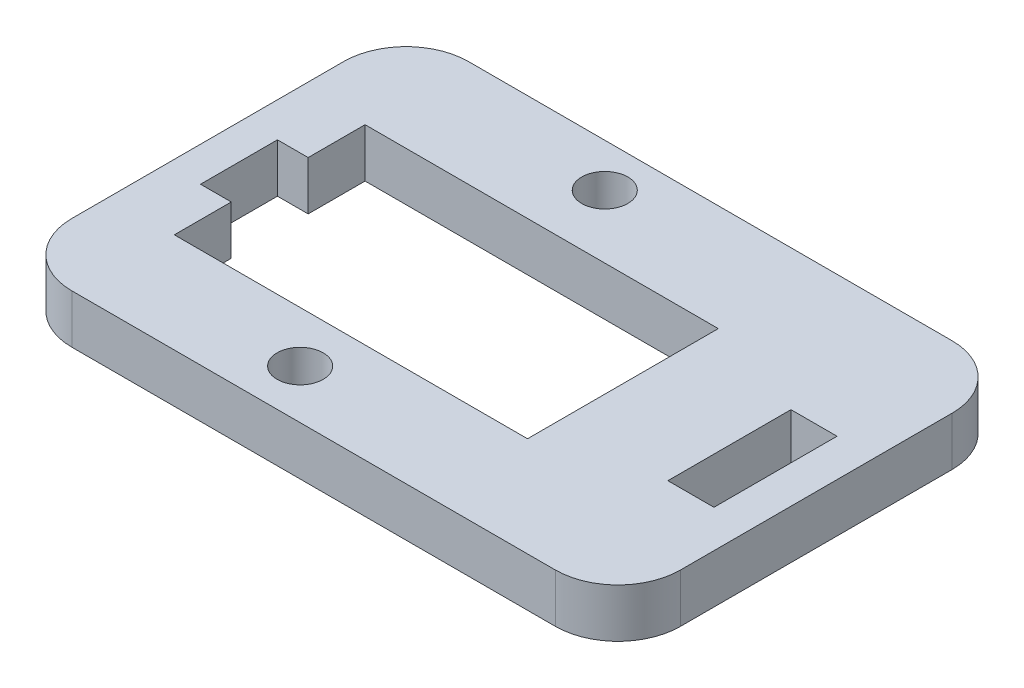
ISO-10303-21;
HEADER;
FILE_DESCRIPTION(('STEP AP214'),'2;1');
FILE_NAME('part.step','',(''),(''),'','','');
FILE_SCHEMA(('AUTOMOTIVE_DESIGN { 1 0 10303 214 1 1 1 1 }'));
ENDSEC;
DATA;
#1=APPLICATION_CONTEXT('core data for automotive mechanical design processes');
#2=APPLICATION_PROTOCOL_DEFINITION('international standard','automotive_design',2000,#1);
#3=PRODUCT_CONTEXT('',#1,'mechanical');
#4=PRODUCT('Part','Part','',(#3));
#5=PRODUCT_RELATED_PRODUCT_CATEGORY('part','',(#4));
#6=PRODUCT_DEFINITION_FORMATION('','',#4);
#7=PRODUCT_DEFINITION_CONTEXT('part definition',#1,'design');
#8=PRODUCT_DEFINITION('design','',#6,#7);
#9=PRODUCT_DEFINITION_SHAPE('','',#8);
#10=(LENGTH_UNIT() NAMED_UNIT(*) SI_UNIT(.MILLI.,.METRE.));
#11=(NAMED_UNIT(*) PLANE_ANGLE_UNIT() SI_UNIT($,.RADIAN.));
#12=(NAMED_UNIT(*) SI_UNIT($,.STERADIAN.) SOLID_ANGLE_UNIT());
#13=UNCERTAINTY_MEASURE_WITH_UNIT(LENGTH_MEASURE(1.E-05),#10,'distance_accuracy_value','');
#14=(GEOMETRIC_REPRESENTATION_CONTEXT(3) GLOBAL_UNCERTAINTY_ASSIGNED_CONTEXT((#13)) GLOBAL_UNIT_ASSIGNED_CONTEXT((#10,
#11,#12)) REPRESENTATION_CONTEXT('',''));
#15=CARTESIAN_POINT('',(0.,0.,0.));
#16=DIRECTION('',(0.,0.,1.));
#17=DIRECTION('',(1.,0.,0.));
#18=AXIS2_PLACEMENT_3D('',#15,#16,#17);
#19=CARTESIAN_POINT('',(-15.7246893452081,3.175,-9.30453983697956));
#20=DIRECTION('',(0.,1.,0.));
#21=DIRECTION('',(0.,0.,1.));
#22=AXIS2_PLACEMENT_3D('',#19,#20,#21);
#23=PLANE('',#22);
#24=CARTESIAN_POINT('',(-4.05405437404931,3.175,-10.5490547460856));
#25=DIRECTION('',(0.,1.,0.));
#26=DIRECTION('',(0.,0.,1.));
#27=AXIS2_PLACEMENT_3D('',#24,#25,#26);
#28=CIRCLE('',#27,1.4972665);
#29=CARTESIAN_POINT('',(-4.05405437404931,3.175,-9.05178824608557));
#30=VERTEX_POINT('',#29);
#31=EDGE_CURVE('E198',#30,#30,#28,.T.);
#32=ORIENTED_EDGE('',*,*,#31,.F.);
#33=EDGE_LOOP('',(#32));
#34=FACE_BOUND('',#33,.T.);
#35=CARTESIAN_POINT('',(-15.7246893452081,3.175,-9.30453983697956));
#36=DIRECTION('',(0.,1.,0.));
#37=DIRECTION('',(0.,0.,1.));
#38=AXIS2_PLACEMENT_3D('',#35,#36,#37);
#39=CIRCLE('',#38,4.06012955345441);
#40=CARTESIAN_POINT('',(-15.7246893452081,3.175,-13.364669390434));
#41=VERTEX_POINT('',#40);
#42=CARTESIAN_POINT('',(-19.7848188986625,3.175,-9.30453983697956));
#43=VERTEX_POINT('',#42);
#44=EDGE_CURVE('E267',#41,#43,#39,.T.);
#45=ORIENTED_EDGE('',*,*,#44,.T.);
#46=DIRECTION('',(0.,0.,1.));
#47=VECTOR('',#46,1.);
#48=CARTESIAN_POINT('',(-19.7848188986625,3.175,8.36700930805023));
#49=LINE('',#48,#47);
#50=CARTESIAN_POINT('',(-19.7848188986625,3.175,8.36700930805023));
#51=VERTEX_POINT('',#50);
#52=EDGE_CURVE('E270',#43,#51,#49,.T.);
#53=ORIENTED_EDGE('',*,*,#52,.T.);
#54=CARTESIAN_POINT('',(-15.7173287794815,3.175,8.36700930805023));
#55=DIRECTION('',(0.,1.,0.));
#56=DIRECTION('',(0.,0.,1.));
#57=AXIS2_PLACEMENT_3D('',#54,#55,#56);
#58=CIRCLE('',#57,4.06749011918107);
#59=CARTESIAN_POINT('',(-15.7173287794815,3.175,12.4344994272313));
#60=VERTEX_POINT('',#59);
#61=EDGE_CURVE('E273',#51,#60,#58,.T.);
#62=ORIENTED_EDGE('',*,*,#61,.T.);
#63=DIRECTION('',(1.,0.,0.));
#64=VECTOR('',#63,1.);
#65=CARTESIAN_POINT('',(15.7245010226577,3.175,12.4344994272313));
#66=LINE('',#65,#64);
#67=CARTESIAN_POINT('',(15.7245010226577,3.175,12.4344994272313));
#68=VERTEX_POINT('',#67);
#69=EDGE_CURVE('E275',#60,#68,#66,.T.);
#70=ORIENTED_EDGE('',*,*,#69,.T.);
#71=CARTESIAN_POINT('',(15.7245010226577,3.175,8.37417522857416));
#72=DIRECTION('',(0.,1.,0.));
#73=DIRECTION('',(0.,0.,1.));
#74=AXIS2_PLACEMENT_3D('',#71,#72,#73);
#75=CIRCLE('',#74,4.06032419865714);
#76=CARTESIAN_POINT('',(19.7848252213149,3.175,8.37417522857416));
#77=VERTEX_POINT('',#76);
#78=EDGE_CURVE('E277',#68,#77,#75,.T.);
#79=ORIENTED_EDGE('',*,*,#78,.T.);
#80=DIRECTION('',(0.,0.,-1.));
#81=VECTOR('',#80,1.);
#82=CARTESIAN_POINT('',(19.7848252213149,3.175,-9.2971845115234));
#83=LINE('',#82,#81);
#84=CARTESIAN_POINT('',(19.7848252213149,3.175,-9.2971845115234));
#85=VERTEX_POINT('',#84);
#86=EDGE_CURVE('E279',#77,#85,#83,.T.);
#87=ORIENTED_EDGE('',*,*,#86,.T.);
#88=CARTESIAN_POINT('',(15.7173403424043,3.175,-9.2971845115234));
#89=DIRECTION('',(0.,1.,0.));
#90=DIRECTION('',(0.,0.,1.));
#91=AXIS2_PLACEMENT_3D('',#88,#89,#90);
#92=CIRCLE('',#91,4.06748487891057);
#93=CARTESIAN_POINT('',(15.7173403424043,3.175,-13.364669390434));
#94=VERTEX_POINT('',#93);
#95=EDGE_CURVE('E281',#85,#94,#92,.T.);
#96=ORIENTED_EDGE('',*,*,#95,.T.);
#97=DIRECTION('',(-1.,0.,0.));
#98=VECTOR('',#97,1.);
#99=CARTESIAN_POINT('',(-15.7246893452081,3.175,-13.364669390434));
#100=LINE('',#99,#98);
#101=EDGE_CURVE('E283',#94,#41,#100,.T.);
#102=ORIENTED_EDGE('',*,*,#101,.T.);
#103=EDGE_LOOP('',(#45,#53,#62,#70,#79,#87,#96,#102));
#104=FACE_BOUND('',#103,.T.);
#105=DIRECTION('',(-1.,0.,0.));
#106=VECTOR('',#105,1.);
#107=CARTESIAN_POINT('',(-17.5301244340511,3.175,-2.74883268240442));
#108=LINE('',#107,#106);
#109=CARTESIAN_POINT('',(-15.5336714157351,3.175,-2.74883268240442));
#110=VERTEX_POINT('',#109);
#111=CARTESIAN_POINT('',(-17.5301244340511,3.175,-2.74883268240442));
#112=VERTEX_POINT('',#111);
#113=EDGE_CURVE('E210',#110,#112,#108,.T.);
#114=ORIENTED_EDGE('',*,*,#113,.F.);
#115=DIRECTION('',(0.,0.,1.));
#116=VECTOR('',#115,1.);
#117=CARTESIAN_POINT('',(-15.5336714157351,3.175,-2.74883268240442));
#118=LINE('',#117,#116);
#119=CARTESIAN_POINT('',(-15.5336714157351,3.175,-6.44905440230704));
#120=VERTEX_POINT('',#119);
#121=EDGE_CURVE('E208',#120,#110,#118,.T.);
#122=ORIENTED_EDGE('',*,*,#121,.F.);
#123=DIRECTION('',(-1.,0.,0.));
#124=VECTOR('',#123,1.);
#125=CARTESIAN_POINT('',(-15.5336714157351,3.175,-6.44905440230704));
#126=LINE('',#125,#124);
#127=CARTESIAN_POINT('',(7.42568939879723,3.175,-6.44905440230704));
#128=VERTEX_POINT('',#127);
#129=EDGE_CURVE('E224',#128,#120,#126,.T.);
#130=ORIENTED_EDGE('',*,*,#129,.F.);
#131=DIRECTION('',(0.,0.,-1.));
#132=VECTOR('',#131,1.);
#133=CARTESIAN_POINT('',(7.42568939879723,3.175,-6.44905440230704));
#134=LINE('',#133,#132);
#135=CARTESIAN_POINT('',(7.42568939879723,3.175,5.95148092713815));
#136=VERTEX_POINT('',#135);
#137=EDGE_CURVE('E221',#136,#128,#134,.T.);
#138=ORIENTED_EDGE('',*,*,#137,.F.);
#139=DIRECTION('',(1.,0.,0.));
#140=VECTOR('',#139,1.);
#141=CARTESIAN_POINT('',(7.42568939879723,3.175,5.95148092713815));
#142=LINE('',#141,#140);
#143=CARTESIAN_POINT('',(-15.5336714157351,3.175,5.95148092713815));
#144=VERTEX_POINT('',#143);
#145=EDGE_CURVE('E219',#144,#136,#142,.T.);
#146=ORIENTED_EDGE('',*,*,#145,.F.);
#147=DIRECTION('',(0.,0.,1.));
#148=VECTOR('',#147,1.);
#149=CARTESIAN_POINT('',(-15.5336714157351,3.175,5.95148092713815));
#150=LINE('',#149,#148);
#151=CARTESIAN_POINT('',(-15.5336714157351,3.175,2.25138616914169));
#152=VERTEX_POINT('',#151);
#153=EDGE_CURVE('E217',#152,#144,#150,.T.);
#154=ORIENTED_EDGE('',*,*,#153,.F.);
#155=DIRECTION('',(1.,0.,0.));
#156=VECTOR('',#155,1.);
#157=CARTESIAN_POINT('',(-15.5336714157351,3.175,2.25138616914169));
#158=LINE('',#157,#156);
#159=CARTESIAN_POINT('',(-17.5301244340511,3.175,2.25138616914169));
#160=VERTEX_POINT('',#159);
#161=EDGE_CURVE('E215',#160,#152,#158,.T.);
#162=ORIENTED_EDGE('',*,*,#161,.F.);
#163=DIRECTION('',(0.,0.,1.));
#164=VECTOR('',#163,1.);
#165=CARTESIAN_POINT('',(-17.5301244340511,3.175,2.25138616914169));
#166=LINE('',#165,#164);
#167=EDGE_CURVE('E213',#112,#160,#166,.T.);
#168=ORIENTED_EDGE('',*,*,#167,.F.);
#169=EDGE_LOOP('',(#114,#122,#130,#138,#146,#154,#162,#168));
#170=FACE_BOUND('',#169,.T.);
#171=DIRECTION('',(1.,0.,0.));
#172=VECTOR('',#171,1.);
#173=CARTESIAN_POINT('',(17.3435744786234,3.175,3.75146061570983));
#174=LINE('',#173,#172);
#175=CARTESIAN_POINT('',(14.348851082275,3.175,3.75146061570983));
#176=VERTEX_POINT('',#175);
#177=CARTESIAN_POINT('',(17.3435744786234,3.175,3.75146061570983));
#178=VERTEX_POINT('',#177);
#179=EDGE_CURVE('E177',#176,#178,#174,.T.);
#180=ORIENTED_EDGE('',*,*,#179,.F.);
#181=DIRECTION('',(0.,0.,1.));
#182=VECTOR('',#181,1.);
#183=CARTESIAN_POINT('',(14.348851082275,3.175,3.75146061570983));
#184=LINE('',#183,#182);
#185=CARTESIAN_POINT('',(14.348851082275,3.175,-4.24890224295414));
#186=VERTEX_POINT('',#185);
#187=EDGE_CURVE('E169',#186,#176,#184,.T.);
#188=ORIENTED_EDGE('',*,*,#187,.F.);
#189=DIRECTION('',(-1.,0.,0.));
#190=VECTOR('',#189,1.);
#191=CARTESIAN_POINT('',(14.348851082275,3.175,-4.24890224295414));
#192=LINE('',#191,#190);
#193=CARTESIAN_POINT('',(17.3435744786234,3.175,-4.24890224295414));
#194=VERTEX_POINT('',#193);
#195=EDGE_CURVE('E192',#194,#186,#192,.T.);
#196=ORIENTED_EDGE('',*,*,#195,.F.);
#197=DIRECTION('',(0.,0.,-1.));
#198=VECTOR('',#197,1.);
#199=CARTESIAN_POINT('',(17.3435744786234,3.175,-4.24890224295414));
#200=LINE('',#199,#198);
#201=EDGE_CURVE('E190',#178,#194,#200,.T.);
#202=ORIENTED_EDGE('',*,*,#201,.F.);
#203=EDGE_LOOP('',(#180,#188,#196,#202));
#204=FACE_BOUND('',#203,.T.);
#205=CARTESIAN_POINT('',(-4.05405437493597,3.175,9.25158220271742));
#206=DIRECTION('',(0.,1.,0.));
#207=DIRECTION('',(0.,0.,1.));
#208=AXIS2_PLACEMENT_3D('',#205,#206,#207);
#209=CIRCLE('',#208,1.4972665);
#210=CARTESIAN_POINT('',(-4.05405437493597,3.175,10.7488487027174));
#211=VERTEX_POINT('',#210);
#212=EDGE_CURVE('E528',#211,#211,#209,.T.);
#213=ORIENTED_EDGE('',*,*,#212,.F.);
#214=EDGE_LOOP('',(#213));
#215=FACE_BOUND('',#214,.T.);
#216=ADVANCED_FACE('F32',(#34,#104,#170,#204,#215),#23,.T.);
#217=CARTESIAN_POINT('',(-15.7246893452081,0.,-9.30453983697956));
#218=DIRECTION('',(0.,1.,0.));
#219=DIRECTION('',(0.,0.,1.));
#220=AXIS2_PLACEMENT_3D('',#217,#218,#219);
#221=PLANE('',#220);
#222=DIRECTION('',(0.,0.,1.));
#223=VECTOR('',#222,1.);
#224=CARTESIAN_POINT('',(-15.5336714157351,0.,-2.74883268240442));
#225=LINE('',#224,#223);
#226=CARTESIAN_POINT('',(-15.5336714157351,0.,-6.44905440230704));
#227=VERTEX_POINT('',#226);
#228=CARTESIAN_POINT('',(-15.5336714157351,0.,-2.74883268240442));
#229=VERTEX_POINT('',#228);
#230=EDGE_CURVE('E185',#227,#229,#225,.T.);
#231=ORIENTED_EDGE('',*,*,#230,.T.);
#232=DIRECTION('',(-1.,0.,0.));
#233=VECTOR('',#232,1.);
#234=CARTESIAN_POINT('',(-17.5301244340511,0.,-2.74883268240442));
#235=LINE('',#234,#233);
#236=CARTESIAN_POINT('',(-17.5301244340511,0.,-2.74883268240442));
#237=VERTEX_POINT('',#236);
#238=EDGE_CURVE('E229',#229,#237,#235,.T.);
#239=ORIENTED_EDGE('',*,*,#238,.T.);
#240=DIRECTION('',(0.,0.,1.));
#241=VECTOR('',#240,1.);
#242=CARTESIAN_POINT('',(-17.5301244340511,0.,2.25138616914169));
#243=LINE('',#242,#241);
#244=CARTESIAN_POINT('',(-17.5301244340511,0.,2.25138616914169));
#245=VERTEX_POINT('',#244);
#246=EDGE_CURVE('E232',#237,#245,#243,.T.);
#247=ORIENTED_EDGE('',*,*,#246,.T.);
#248=DIRECTION('',(1.,0.,0.));
#249=VECTOR('',#248,1.);
#250=CARTESIAN_POINT('',(-15.5336714157351,0.,2.25138616914169));
#251=LINE('',#250,#249);
#252=CARTESIAN_POINT('',(-15.5336714157351,0.,2.25138616914169));
#253=VERTEX_POINT('',#252);
#254=EDGE_CURVE('E235',#245,#253,#251,.T.);
#255=ORIENTED_EDGE('',*,*,#254,.T.);
#256=DIRECTION('',(0.,0.,1.));
#257=VECTOR('',#256,1.);
#258=CARTESIAN_POINT('',(-15.5336714157351,0.,5.95148092713815));
#259=LINE('',#258,#257);
#260=CARTESIAN_POINT('',(-15.5336714157351,0.,5.95148092713815));
#261=VERTEX_POINT('',#260);
#262=EDGE_CURVE('E238',#253,#261,#259,.T.);
#263=ORIENTED_EDGE('',*,*,#262,.T.);
#264=DIRECTION('',(1.,0.,0.));
#265=VECTOR('',#264,1.);
#266=CARTESIAN_POINT('',(7.42568939879723,0.,5.95148092713815));
#267=LINE('',#266,#265);
#268=CARTESIAN_POINT('',(7.42568939879723,0.,5.95148092713815));
#269=VERTEX_POINT('',#268);
#270=EDGE_CURVE('E241',#261,#269,#267,.T.);
#271=ORIENTED_EDGE('',*,*,#270,.T.);
#272=DIRECTION('',(0.,0.,-1.));
#273=VECTOR('',#272,1.);
#274=CARTESIAN_POINT('',(7.42568939879723,0.,-6.44905440230704));
#275=LINE('',#274,#273);
#276=CARTESIAN_POINT('',(7.42568939879723,0.,-6.44905440230704));
#277=VERTEX_POINT('',#276);
#278=EDGE_CURVE('E244',#269,#277,#275,.T.);
#279=ORIENTED_EDGE('',*,*,#278,.T.);
#280=DIRECTION('',(-1.,0.,0.));
#281=VECTOR('',#280,1.);
#282=CARTESIAN_POINT('',(-15.5336714157351,0.,-6.44905440230704));
#283=LINE('',#282,#281);
#284=EDGE_CURVE('E211',#277,#227,#283,.T.);
#285=ORIENTED_EDGE('',*,*,#284,.T.);
#286=EDGE_LOOP('',(#231,#239,#247,#255,#263,#271,#279,#285));
#287=FACE_BOUND('',#286,.T.);
#288=CARTESIAN_POINT('',(-15.7246893452081,0.,-9.30453983697956));
#289=DIRECTION('',(0.,1.,0.));
#290=DIRECTION('',(0.,0.,1.));
#291=AXIS2_PLACEMENT_3D('',#288,#289,#290);
#292=CIRCLE('',#291,4.06012955345441);
#293=CARTESIAN_POINT('',(-15.7246893452081,0.,-13.364669390434));
#294=VERTEX_POINT('',#293);
#295=CARTESIAN_POINT('',(-19.7848188986625,0.,-9.30453983697956));
#296=VERTEX_POINT('',#295);
#297=EDGE_CURVE('E266',#294,#296,#292,.T.);
#298=ORIENTED_EDGE('',*,*,#297,.F.);
#299=DIRECTION('',(-1.,0.,0.));
#300=VECTOR('',#299,1.);
#301=CARTESIAN_POINT('',(-15.7246893452081,0.,-13.364669390434));
#302=LINE('',#301,#300);
#303=CARTESIAN_POINT('',(15.7173403424043,0.,-13.364669390434));
#304=VERTEX_POINT('',#303);
#305=EDGE_CURVE('E271',#304,#294,#302,.T.);
#306=ORIENTED_EDGE('',*,*,#305,.F.);
#307=CARTESIAN_POINT('',(15.7173403424043,0.,-9.2971845115234));
#308=DIRECTION('',(0.,1.,0.));
#309=DIRECTION('',(0.,0.,1.));
#310=AXIS2_PLACEMENT_3D('',#307,#308,#309);
#311=CIRCLE('',#310,4.06748487891057);
#312=CARTESIAN_POINT('',(19.7848252213149,0.,-9.2971845115234));
#313=VERTEX_POINT('',#312);
#314=EDGE_CURVE('E298',#313,#304,#311,.T.);
#315=ORIENTED_EDGE('',*,*,#314,.F.);
#316=DIRECTION('',(0.,0.,-1.));
#317=VECTOR('',#316,1.);
#318=CARTESIAN_POINT('',(19.7848252213149,0.,-9.2971845115234));
#319=LINE('',#318,#317);
#320=CARTESIAN_POINT('',(19.7848252213149,0.,8.37417522857416));
#321=VERTEX_POINT('',#320);
#322=EDGE_CURVE('E296',#321,#313,#319,.T.);
#323=ORIENTED_EDGE('',*,*,#322,.F.);
#324=CARTESIAN_POINT('',(15.7245010226577,0.,8.37417522857416));
#325=DIRECTION('',(0.,1.,0.));
#326=DIRECTION('',(0.,0.,1.));
#327=AXIS2_PLACEMENT_3D('',#324,#325,#326);
#328=CIRCLE('',#327,4.06032419865714);
#329=CARTESIAN_POINT('',(15.7245010226577,0.,12.4344994272313));
#330=VERTEX_POINT('',#329);
#331=EDGE_CURVE('E294',#330,#321,#328,.T.);
#332=ORIENTED_EDGE('',*,*,#331,.F.);
#333=DIRECTION('',(1.,0.,0.));
#334=VECTOR('',#333,1.);
#335=CARTESIAN_POINT('',(15.7245010226577,0.,12.4344994272313));
#336=LINE('',#335,#334);
#337=CARTESIAN_POINT('',(-15.7173287794815,0.,12.4344994272313));
#338=VERTEX_POINT('',#337);
#339=EDGE_CURVE('E292',#338,#330,#336,.T.);
#340=ORIENTED_EDGE('',*,*,#339,.F.);
#341=CARTESIAN_POINT('',(-15.7173287794815,0.,8.36700930805023));
#342=DIRECTION('',(0.,1.,0.));
#343=DIRECTION('',(0.,0.,1.));
#344=AXIS2_PLACEMENT_3D('',#341,#342,#343);
#345=CIRCLE('',#344,4.06749011918107);
#346=CARTESIAN_POINT('',(-19.7848188986625,0.,8.36700930805023));
#347=VERTEX_POINT('',#346);
#348=EDGE_CURVE('E290',#347,#338,#345,.T.);
#349=ORIENTED_EDGE('',*,*,#348,.F.);
#350=DIRECTION('',(0.,0.,1.));
#351=VECTOR('',#350,1.);
#352=CARTESIAN_POINT('',(-19.7848188986625,0.,8.36700930805023));
#353=LINE('',#352,#351);
#354=EDGE_CURVE('E288',#296,#347,#353,.T.);
#355=ORIENTED_EDGE('',*,*,#354,.F.);
#356=EDGE_LOOP('',(#298,#306,#315,#323,#332,#340,#349,#355));
#357=FACE_BOUND('',#356,.T.);
#358=DIRECTION('',(0.,0.,1.));
#359=VECTOR('',#358,1.);
#360=CARTESIAN_POINT('',(14.348851082275,0.,3.75146061570983));
#361=LINE('',#360,#359);
#362=CARTESIAN_POINT('',(14.348851082275,0.,-4.24890224295414));
#363=VERTEX_POINT('',#362);
#364=CARTESIAN_POINT('',(14.348851082275,0.,3.75146061570983));
#365=VERTEX_POINT('',#364);
#366=EDGE_CURVE('E55',#363,#365,#361,.T.);
#367=ORIENTED_EDGE('',*,*,#366,.T.);
#368=DIRECTION('',(1.,0.,0.));
#369=VECTOR('',#368,1.);
#370=CARTESIAN_POINT('',(17.3435744786234,0.,3.75146061570983));
#371=LINE('',#370,#369);
#372=CARTESIAN_POINT('',(17.3435744786234,0.,3.75146061570983));
#373=VERTEX_POINT('',#372);
#374=EDGE_CURVE('E184',#365,#373,#371,.T.);
#375=ORIENTED_EDGE('',*,*,#374,.T.);
#376=DIRECTION('',(0.,0.,-1.));
#377=VECTOR('',#376,1.);
#378=CARTESIAN_POINT('',(17.3435744786234,0.,-4.24890224295414));
#379=LINE('',#378,#377);
#380=CARTESIAN_POINT('',(17.3435744786234,0.,-4.24890224295414));
#381=VERTEX_POINT('',#380);
#382=EDGE_CURVE('E200',#373,#381,#379,.T.);
#383=ORIENTED_EDGE('',*,*,#382,.T.);
#384=DIRECTION('',(-1.,0.,0.));
#385=VECTOR('',#384,1.);
#386=CARTESIAN_POINT('',(14.348851082275,0.,-4.24890224295414));
#387=LINE('',#386,#385);
#388=EDGE_CURVE('E178',#381,#363,#387,.T.);
#389=ORIENTED_EDGE('',*,*,#388,.T.);
#390=EDGE_LOOP('',(#367,#375,#383,#389));
#391=FACE_BOUND('',#390,.T.);
#392=CARTESIAN_POINT('',(-4.05405437404931,0.,-10.5490547460856));
#393=DIRECTION('',(0.,1.,0.));
#394=DIRECTION('',(0.,0.,1.));
#395=AXIS2_PLACEMENT_3D('',#392,#393,#394);
#396=CIRCLE('',#395,1.4972665);
#397=CARTESIAN_POINT('',(-4.05405437404931,0.,-9.05178824608557));
#398=VERTEX_POINT('',#397);
#399=EDGE_CURVE('E534',#398,#398,#396,.T.);
#400=ORIENTED_EDGE('',*,*,#399,.T.);
#401=EDGE_LOOP('',(#400));
#402=FACE_BOUND('',#401,.T.);
#403=CARTESIAN_POINT('',(-4.05405437493597,0.,9.25158220271742));
#404=DIRECTION('',(0.,1.,0.));
#405=DIRECTION('',(0.,0.,1.));
#406=AXIS2_PLACEMENT_3D('',#403,#404,#405);
#407=CIRCLE('',#406,1.4972665);
#408=CARTESIAN_POINT('',(-4.05405437493597,0.,10.7488487027174));
#409=VERTEX_POINT('',#408);
#410=EDGE_CURVE('E531',#409,#409,#407,.T.);
#411=ORIENTED_EDGE('',*,*,#410,.T.);
#412=EDGE_LOOP('',(#411));
#413=FACE_BOUND('',#412,.T.);
#414=ADVANCED_FACE('F328',(#287,#357,#391,#402,#413),#221,.F.);
#415=CARTESIAN_POINT('',(-15.7246893452081,3.175,-9.30453983697956));
#416=DIRECTION('',(0.,-1.,0.));
#417=DIRECTION('',(0.,0.,-1.));
#418=AXIS2_PLACEMENT_3D('',#415,#416,#417);
#419=CYLINDRICAL_SURFACE('',#418,4.06012955345441);
#420=ORIENTED_EDGE('',*,*,#297,.T.);
#421=DIRECTION('',(0.,-1.,0.));
#422=VECTOR('',#421,1.);
#423=CARTESIAN_POINT('',(-19.7848188986625,3.175,-9.30453983697956));
#424=LINE('',#423,#422);
#425=EDGE_CURVE('E11',#43,#296,#424,.T.);
#426=ORIENTED_EDGE('',*,*,#425,.F.);
#427=ORIENTED_EDGE('',*,*,#44,.F.);
#428=DIRECTION('',(0.,-1.,0.));
#429=VECTOR('',#428,1.);
#430=CARTESIAN_POINT('',(-15.7246893452081,3.175,-13.364669390434));
#431=LINE('',#430,#429);
#432=EDGE_CURVE('E285',#41,#294,#431,.T.);
#433=ORIENTED_EDGE('',*,*,#432,.T.);
#434=EDGE_LOOP('',(#420,#426,#427,#433));
#435=FACE_BOUND('',#434,.T.);
#436=ADVANCED_FACE('F34',(#435),#419,.T.);
#437=CARTESIAN_POINT('',(-19.7848188986625,3.175,8.36700930805023));
#438=DIRECTION('',(1.,0.,0.));
#439=DIRECTION('',(0.,0.,-1.));
#440=AXIS2_PLACEMENT_3D('',#437,#438,#439);
#441=PLANE('',#440);
#442=ORIENTED_EDGE('',*,*,#354,.T.);
#443=DIRECTION('',(0.,-1.,0.));
#444=VECTOR('',#443,1.);
#445=CARTESIAN_POINT('',(-19.7848188986625,3.175,8.36700930805023));
#446=LINE('',#445,#444);
#447=EDGE_CURVE('E40',#51,#347,#446,.T.);
#448=ORIENTED_EDGE('',*,*,#447,.F.);
#449=ORIENTED_EDGE('',*,*,#52,.F.);
#450=ORIENTED_EDGE('',*,*,#425,.T.);
#451=EDGE_LOOP('',(#442,#448,#449,#450));
#452=FACE_BOUND('',#451,.T.);
#453=ADVANCED_FACE('F346',(#452),#441,.F.);
#454=CARTESIAN_POINT('',(-15.7173287794815,3.175,8.36700930805023));
#455=DIRECTION('',(0.,-1.,0.));
#456=DIRECTION('',(0.,0.,-1.));
#457=AXIS2_PLACEMENT_3D('',#454,#455,#456);
#458=CYLINDRICAL_SURFACE('',#457,4.06749011918107);
#459=ORIENTED_EDGE('',*,*,#348,.T.);
#460=DIRECTION('',(0.,-1.,0.));
#461=VECTOR('',#460,1.);
#462=CARTESIAN_POINT('',(-15.7173287794815,3.175,12.4344994272313));
#463=LINE('',#462,#461);
#464=EDGE_CURVE('E315',#60,#338,#463,.T.);
#465=ORIENTED_EDGE('',*,*,#464,.F.);
#466=ORIENTED_EDGE('',*,*,#61,.F.);
#467=ORIENTED_EDGE('',*,*,#447,.T.);
#468=EDGE_LOOP('',(#459,#465,#466,#467));
#469=FACE_BOUND('',#468,.T.);
#470=ADVANCED_FACE('F322',(#469),#458,.T.);
#471=CARTESIAN_POINT('',(15.7245010226577,3.175,12.4344994272313));
#472=DIRECTION('',(0.,0.,-1.));
#473=DIRECTION('',(-1.,0.,0.));
#474=AXIS2_PLACEMENT_3D('',#471,#472,#473);
#475=PLANE('',#474);
#476=ORIENTED_EDGE('',*,*,#339,.T.);
#477=DIRECTION('',(0.,-1.,0.));
#478=VECTOR('',#477,1.);
#479=CARTESIAN_POINT('',(15.7245010226577,3.175,12.4344994272313));
#480=LINE('',#479,#478);
#481=EDGE_CURVE('E312',#68,#330,#480,.T.);
#482=ORIENTED_EDGE('',*,*,#481,.F.);
#483=ORIENTED_EDGE('',*,*,#69,.F.);
#484=ORIENTED_EDGE('',*,*,#464,.T.);
#485=EDGE_LOOP('',(#476,#482,#483,#484));
#486=FACE_BOUND('',#485,.T.);
#487=ADVANCED_FACE('F334',(#486),#475,.F.);
#488=CARTESIAN_POINT('',(15.7245010226577,3.175,8.37417522857416));
#489=DIRECTION('',(0.,-1.,0.));
#490=DIRECTION('',(0.,0.,-1.));
#491=AXIS2_PLACEMENT_3D('',#488,#489,#490);
#492=CYLINDRICAL_SURFACE('',#491,4.06032419865714);
#493=ORIENTED_EDGE('',*,*,#331,.T.);
#494=DIRECTION('',(0.,-1.,0.));
#495=VECTOR('',#494,1.);
#496=CARTESIAN_POINT('',(19.7848252213149,3.175,8.37417522857416));
#497=LINE('',#496,#495);
#498=EDGE_CURVE('E309',#77,#321,#497,.T.);
#499=ORIENTED_EDGE('',*,*,#498,.F.);
#500=ORIENTED_EDGE('',*,*,#78,.F.);
#501=ORIENTED_EDGE('',*,*,#481,.T.);
#502=EDGE_LOOP('',(#493,#499,#500,#501));
#503=FACE_BOUND('',#502,.T.);
#504=ADVANCED_FACE('F338',(#503),#492,.T.);
#505=CARTESIAN_POINT('',(19.7848252213149,3.175,-9.2971845115234));
#506=DIRECTION('',(-1.,0.,0.));
#507=DIRECTION('',(0.,0.,1.));
#508=AXIS2_PLACEMENT_3D('',#505,#506,#507);
#509=PLANE('',#508);
#510=ORIENTED_EDGE('',*,*,#322,.T.);
#511=DIRECTION('',(0.,-1.,0.));
#512=VECTOR('',#511,1.);
#513=CARTESIAN_POINT('',(19.7848252213149,3.175,-9.2971845115234));
#514=LINE('',#513,#512);
#515=EDGE_CURVE('E306',#85,#313,#514,.T.);
#516=ORIENTED_EDGE('',*,*,#515,.F.);
#517=ORIENTED_EDGE('',*,*,#86,.F.);
#518=ORIENTED_EDGE('',*,*,#498,.T.);
#519=EDGE_LOOP('',(#510,#516,#517,#518));
#520=FACE_BOUND('',#519,.T.);
#521=ADVANCED_FACE('F359',(#520),#509,.F.);
#522=CARTESIAN_POINT('',(15.7173403424043,3.175,-9.2971845115234));
#523=DIRECTION('',(0.,-1.,0.));
#524=DIRECTION('',(0.,0.,-1.));
#525=AXIS2_PLACEMENT_3D('',#522,#523,#524);
#526=CYLINDRICAL_SURFACE('',#525,4.06748487891057);
#527=ORIENTED_EDGE('',*,*,#314,.T.);
#528=DIRECTION('',(0.,-1.,0.));
#529=VECTOR('',#528,1.);
#530=CARTESIAN_POINT('',(15.7173403424043,3.175,-13.364669390434));
#531=LINE('',#530,#529);
#532=EDGE_CURVE('E303',#94,#304,#531,.T.);
#533=ORIENTED_EDGE('',*,*,#532,.F.);
#534=ORIENTED_EDGE('',*,*,#95,.F.);
#535=ORIENTED_EDGE('',*,*,#515,.T.);
#536=EDGE_LOOP('',(#527,#533,#534,#535));
#537=FACE_BOUND('',#536,.T.);
#538=ADVANCED_FACE('F357',(#537),#526,.T.);
#539=CARTESIAN_POINT('',(-15.7246893452081,3.175,-13.364669390434));
#540=DIRECTION('',(0.,0.,1.));
#541=DIRECTION('',(1.,0.,0.));
#542=AXIS2_PLACEMENT_3D('',#539,#540,#541);
#543=PLANE('',#542);
#544=ORIENTED_EDGE('',*,*,#305,.T.);
#545=ORIENTED_EDGE('',*,*,#432,.F.);
#546=ORIENTED_EDGE('',*,*,#101,.F.);
#547=ORIENTED_EDGE('',*,*,#532,.T.);
#548=EDGE_LOOP('',(#544,#545,#546,#547));
#549=FACE_BOUND('',#548,.T.);
#550=ADVANCED_FACE('F352',(#549),#543,.F.);
#551=CARTESIAN_POINT('',(-15.5336714157351,3.175,-2.74883268240442));
#552=DIRECTION('',(1.,0.,0.));
#553=DIRECTION('',(0.,0.,-1.));
#554=AXIS2_PLACEMENT_3D('',#551,#552,#553);
#555=PLANE('',#554);
#556=ORIENTED_EDGE('',*,*,#230,.F.);
#557=DIRECTION('',(0.,-1.,0.));
#558=VECTOR('',#557,1.);
#559=CARTESIAN_POINT('',(-15.5336714157351,3.175,-6.44905440230704));
#560=LINE('',#559,#558);
#561=EDGE_CURVE('E226',#120,#227,#560,.T.);
#562=ORIENTED_EDGE('',*,*,#561,.F.);
#563=ORIENTED_EDGE('',*,*,#121,.T.);
#564=DIRECTION('',(0.,-1.,0.));
#565=VECTOR('',#564,1.);
#566=CARTESIAN_POINT('',(-15.5336714157351,3.175,-2.74883268240442));
#567=LINE('',#566,#565);
#568=EDGE_CURVE('E263',#110,#229,#567,.T.);
#569=ORIENTED_EDGE('',*,*,#568,.T.);
#570=EDGE_LOOP('',(#556,#562,#563,#569));
#571=FACE_BOUND('',#570,.T.);
#572=ADVANCED_FACE('F378',(#571),#555,.T.);
#573=CARTESIAN_POINT('',(-17.5301244340511,3.175,-2.74883268240442));
#574=DIRECTION('',(0.,0.,1.));
#575=DIRECTION('',(1.,0.,0.));
#576=AXIS2_PLACEMENT_3D('',#573,#574,#575);
#577=PLANE('',#576);
#578=ORIENTED_EDGE('',*,*,#238,.F.);
#579=ORIENTED_EDGE('',*,*,#568,.F.);
#580=ORIENTED_EDGE('',*,*,#113,.T.);
#581=DIRECTION('',(0.,-1.,0.));
#582=VECTOR('',#581,1.);
#583=CARTESIAN_POINT('',(-17.5301244340511,3.175,-2.74883268240442));
#584=LINE('',#583,#582);
#585=EDGE_CURVE('E261',#112,#237,#584,.T.);
#586=ORIENTED_EDGE('',*,*,#585,.T.);
#587=EDGE_LOOP('',(#578,#579,#580,#586));
#588=FACE_BOUND('',#587,.T.);
#589=ADVANCED_FACE('F385',(#588),#577,.T.);
#590=CARTESIAN_POINT('',(-17.5301244340511,3.175,2.25138616914169));
#591=DIRECTION('',(1.,0.,0.));
#592=DIRECTION('',(0.,0.,-1.));
#593=AXIS2_PLACEMENT_3D('',#590,#591,#592);
#594=PLANE('',#593);
#595=ORIENTED_EDGE('',*,*,#246,.F.);
#596=ORIENTED_EDGE('',*,*,#585,.F.);
#597=ORIENTED_EDGE('',*,*,#167,.T.);
#598=DIRECTION('',(0.,-1.,0.));
#599=VECTOR('',#598,1.);
#600=CARTESIAN_POINT('',(-17.5301244340511,3.175,2.25138616914169));
#601=LINE('',#600,#599);
#602=EDGE_CURVE('E259',#160,#245,#601,.T.);
#603=ORIENTED_EDGE('',*,*,#602,.T.);
#604=EDGE_LOOP('',(#595,#596,#597,#603));
#605=FACE_BOUND('',#604,.T.);
#606=ADVANCED_FACE('F390',(#605),#594,.T.);
#607=CARTESIAN_POINT('',(-15.5336714157351,3.175,2.25138616914169));
#608=DIRECTION('',(0.,0.,-1.));
#609=DIRECTION('',(-1.,0.,0.));
#610=AXIS2_PLACEMENT_3D('',#607,#608,#609);
#611=PLANE('',#610);
#612=ORIENTED_EDGE('',*,*,#254,.F.);
#613=ORIENTED_EDGE('',*,*,#602,.F.);
#614=ORIENTED_EDGE('',*,*,#161,.T.);
#615=DIRECTION('',(0.,-1.,0.));
#616=VECTOR('',#615,1.);
#617=CARTESIAN_POINT('',(-15.5336714157351,3.175,2.25138616914169));
#618=LINE('',#617,#616);
#619=EDGE_CURVE('E257',#152,#253,#618,.T.);
#620=ORIENTED_EDGE('',*,*,#619,.T.);
#621=EDGE_LOOP('',(#612,#613,#614,#620));
#622=FACE_BOUND('',#621,.T.);
#623=ADVANCED_FACE('F415',(#622),#611,.T.);
#624=CARTESIAN_POINT('',(-15.5336714157351,3.175,5.95148092713815));
#625=DIRECTION('',(1.,0.,0.));
#626=DIRECTION('',(0.,0.,-1.));
#627=AXIS2_PLACEMENT_3D('',#624,#625,#626);
#628=PLANE('',#627);
#629=ORIENTED_EDGE('',*,*,#262,.F.);
#630=ORIENTED_EDGE('',*,*,#619,.F.);
#631=ORIENTED_EDGE('',*,*,#153,.T.);
#632=DIRECTION('',(0.,-1.,0.));
#633=VECTOR('',#632,1.);
#634=CARTESIAN_POINT('',(-15.5336714157351,3.175,5.95148092713815));
#635=LINE('',#634,#633);
#636=EDGE_CURVE('E255',#144,#261,#635,.T.);
#637=ORIENTED_EDGE('',*,*,#636,.T.);
#638=EDGE_LOOP('',(#629,#630,#631,#637));
#639=FACE_BOUND('',#638,.T.);
#640=ADVANCED_FACE('F420',(#639),#628,.T.);
#641=CARTESIAN_POINT('',(7.42568939879723,3.175,5.95148092713815));
#642=DIRECTION('',(0.,0.,-1.));
#643=DIRECTION('',(-1.,0.,0.));
#644=AXIS2_PLACEMENT_3D('',#641,#642,#643);
#645=PLANE('',#644);
#646=ORIENTED_EDGE('',*,*,#270,.F.);
#647=ORIENTED_EDGE('',*,*,#636,.F.);
#648=ORIENTED_EDGE('',*,*,#145,.T.);
#649=DIRECTION('',(0.,-1.,0.));
#650=VECTOR('',#649,1.);
#651=CARTESIAN_POINT('',(7.42568939879723,3.175,5.95148092713815));
#652=LINE('',#651,#650);
#653=EDGE_CURVE('E253',#136,#269,#652,.T.);
#654=ORIENTED_EDGE('',*,*,#653,.T.);
#655=EDGE_LOOP('',(#646,#647,#648,#654));
#656=FACE_BOUND('',#655,.T.);
#657=ADVANCED_FACE('F423',(#656),#645,.T.);
#658=CARTESIAN_POINT('',(7.42568939879723,3.175,-6.44905440230704));
#659=DIRECTION('',(-1.,0.,0.));
#660=DIRECTION('',(0.,0.,1.));
#661=AXIS2_PLACEMENT_3D('',#658,#659,#660);
#662=PLANE('',#661);
#663=ORIENTED_EDGE('',*,*,#278,.F.);
#664=ORIENTED_EDGE('',*,*,#653,.F.);
#665=ORIENTED_EDGE('',*,*,#137,.T.);
#666=DIRECTION('',(0.,-1.,0.));
#667=VECTOR('',#666,1.);
#668=CARTESIAN_POINT('',(7.42568939879723,3.175,-6.44905440230704));
#669=LINE('',#668,#667);
#670=EDGE_CURVE('E251',#128,#277,#669,.T.);
#671=ORIENTED_EDGE('',*,*,#670,.T.);
#672=EDGE_LOOP('',(#663,#664,#665,#671));
#673=FACE_BOUND('',#672,.T.);
#674=ADVANCED_FACE('F403',(#673),#662,.T.);
#675=CARTESIAN_POINT('',(-15.5336714157351,3.175,-6.44905440230704));
#676=DIRECTION('',(0.,0.,1.));
#677=DIRECTION('',(1.,0.,0.));
#678=AXIS2_PLACEMENT_3D('',#675,#676,#677);
#679=PLANE('',#678);
#680=ORIENTED_EDGE('',*,*,#284,.F.);
#681=ORIENTED_EDGE('',*,*,#670,.F.);
#682=ORIENTED_EDGE('',*,*,#129,.T.);
#683=ORIENTED_EDGE('',*,*,#561,.T.);
#684=EDGE_LOOP('',(#680,#681,#682,#683));
#685=FACE_BOUND('',#684,.T.);
#686=ADVANCED_FACE('F397',(#685),#679,.T.);
#687=CARTESIAN_POINT('',(14.348851082275,3.175,3.75146061570983));
#688=DIRECTION('',(1.,0.,0.));
#689=DIRECTION('',(0.,0.,-1.));
#690=AXIS2_PLACEMENT_3D('',#687,#688,#689);
#691=PLANE('',#690);
#692=ORIENTED_EDGE('',*,*,#366,.F.);
#693=DIRECTION('',(0.,-1.,0.));
#694=VECTOR('',#693,1.);
#695=CARTESIAN_POINT('',(14.348851082275,3.175,-4.24890224295414));
#696=LINE('',#695,#694);
#697=EDGE_CURVE('E173',#186,#363,#696,.T.);
#698=ORIENTED_EDGE('',*,*,#697,.F.);
#699=ORIENTED_EDGE('',*,*,#187,.T.);
#700=DIRECTION('',(0.,-1.,0.));
#701=VECTOR('',#700,1.);
#702=CARTESIAN_POINT('',(14.348851082275,3.175,3.75146061570983));
#703=LINE('',#702,#701);
#704=EDGE_CURVE('E172',#176,#365,#703,.T.);
#705=ORIENTED_EDGE('',*,*,#704,.T.);
#706=EDGE_LOOP('',(#692,#698,#699,#705));
#707=FACE_BOUND('',#706,.T.);
#708=ADVANCED_FACE('F171',(#707),#691,.T.);
#709=CARTESIAN_POINT('',(17.3435744786234,3.175,3.75146061570983));
#710=DIRECTION('',(0.,0.,-1.));
#711=DIRECTION('',(-1.,0.,0.));
#712=AXIS2_PLACEMENT_3D('',#709,#710,#711);
#713=PLANE('',#712);
#714=ORIENTED_EDGE('',*,*,#374,.F.);
#715=ORIENTED_EDGE('',*,*,#704,.F.);
#716=ORIENTED_EDGE('',*,*,#179,.T.);
#717=DIRECTION('',(0.,-1.,0.));
#718=VECTOR('',#717,1.);
#719=CARTESIAN_POINT('',(17.3435744786234,3.175,3.75146061570983));
#720=LINE('',#719,#718);
#721=EDGE_CURVE('E186',#178,#373,#720,.T.);
#722=ORIENTED_EDGE('',*,*,#721,.T.);
#723=EDGE_LOOP('',(#714,#715,#716,#722));
#724=FACE_BOUND('',#723,.T.);
#725=ADVANCED_FACE('F181',(#724),#713,.T.);
#726=CARTESIAN_POINT('',(17.3435744786234,3.175,-4.24890224295414));
#727=DIRECTION('',(-1.,0.,0.));
#728=DIRECTION('',(0.,0.,1.));
#729=AXIS2_PLACEMENT_3D('',#726,#727,#728);
#730=PLANE('',#729);
#731=ORIENTED_EDGE('',*,*,#382,.F.);
#732=ORIENTED_EDGE('',*,*,#721,.F.);
#733=ORIENTED_EDGE('',*,*,#201,.T.);
#734=DIRECTION('',(0.,-1.,0.));
#735=VECTOR('',#734,1.);
#736=CARTESIAN_POINT('',(17.3435744786234,3.175,-4.24890224295414));
#737=LINE('',#736,#735);
#738=EDGE_CURVE('E47',#194,#381,#737,.T.);
#739=ORIENTED_EDGE('',*,*,#738,.T.);
#740=EDGE_LOOP('',(#731,#732,#733,#739));
#741=FACE_BOUND('',#740,.T.);
#742=ADVANCED_FACE('F483',(#741),#730,.T.);
#743=CARTESIAN_POINT('',(14.348851082275,3.175,-4.24890224295414));
#744=DIRECTION('',(0.,0.,1.));
#745=DIRECTION('',(1.,0.,0.));
#746=AXIS2_PLACEMENT_3D('',#743,#744,#745);
#747=PLANE('',#746);
#748=ORIENTED_EDGE('',*,*,#388,.F.);
#749=ORIENTED_EDGE('',*,*,#738,.F.);
#750=ORIENTED_EDGE('',*,*,#195,.T.);
#751=ORIENTED_EDGE('',*,*,#697,.T.);
#752=EDGE_LOOP('',(#748,#749,#750,#751));
#753=FACE_BOUND('',#752,.T.);
#754=ADVANCED_FACE('F492',(#753),#747,.T.);
#755=CARTESIAN_POINT('',(-4.05405437404931,3.175,-10.5490547460856));
#756=DIRECTION('',(0.,-1.,0.));
#757=DIRECTION('',(0.,0.,-1.));
#758=AXIS2_PLACEMENT_3D('',#755,#756,#757);
#759=CYLINDRICAL_SURFACE('',#758,1.4972665);
#760=ORIENTED_EDGE('',*,*,#31,.T.);
#761=EDGE_LOOP('',(#760));
#762=FACE_BOUND('',#761,.T.);
#763=ORIENTED_EDGE('',*,*,#399,.F.);
#764=EDGE_LOOP('',(#763));
#765=FACE_BOUND('',#764,.T.);
#766=ADVANCED_FACE('F502',(#762,#765),#759,.F.);
#767=CARTESIAN_POINT('',(-4.05405437493597,3.175,9.25158220271742));
#768=DIRECTION('',(0.,-1.,0.));
#769=DIRECTION('',(0.,0.,-1.));
#770=AXIS2_PLACEMENT_3D('',#767,#768,#769);
#771=CYLINDRICAL_SURFACE('',#770,1.4972665);
#772=ORIENTED_EDGE('',*,*,#212,.T.);
#773=EDGE_LOOP('',(#772));
#774=FACE_BOUND('',#773,.T.);
#775=ORIENTED_EDGE('',*,*,#410,.F.);
#776=EDGE_LOOP('',(#775));
#777=FACE_BOUND('',#776,.T.);
#778=ADVANCED_FACE('F511',(#774,#777),#771,.F.);
#779=CLOSED_SHELL('',(#216,#414,#436,#453,#470,#487,#504,#521,#538,#550,#572,#589,#606,#623,
#640,#657,#674,#686,#708,#725,#742,#754,#766,#778));
#780=MANIFOLD_SOLID_BREP('B2',#779);
#781=ADVANCED_BREP_SHAPE_REPRESENTATION('',(#18,#780),#14);
#782=SHAPE_DEFINITION_REPRESENTATION(#9,#781);
ENDSEC;
END-ISO-10303-21;
